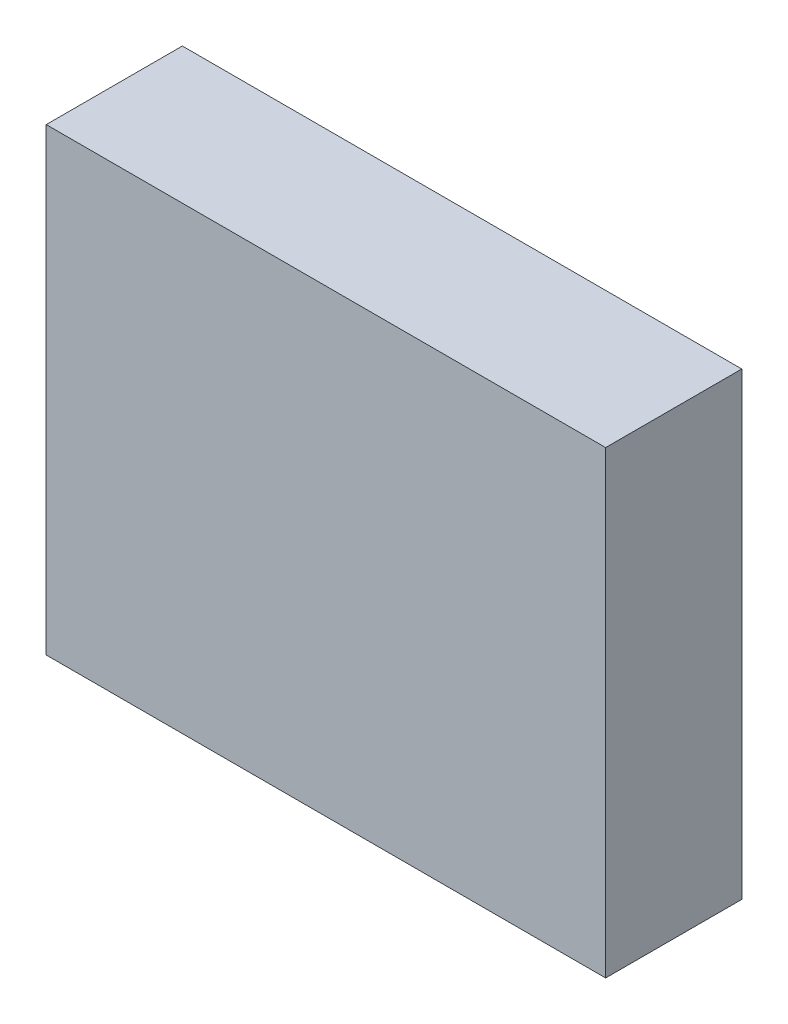
ISO-10303-21;
HEADER;
FILE_DESCRIPTION(('STEP AP214'),'2;1');
FILE_NAME('part.step','',(''),(''),'','','');
FILE_SCHEMA(('AUTOMOTIVE_DESIGN { 1 0 10303 214 1 1 1 1 }'));
ENDSEC;
DATA;
#1=APPLICATION_CONTEXT('core data for automotive mechanical design processes');
#2=APPLICATION_PROTOCOL_DEFINITION('international standard','automotive_design',2000,#1);
#3=PRODUCT_CONTEXT('',#1,'mechanical');
#4=PRODUCT('Part','Part','',(#3));
#5=PRODUCT_RELATED_PRODUCT_CATEGORY('part','',(#4));
#6=PRODUCT_DEFINITION_FORMATION('','',#4);
#7=PRODUCT_DEFINITION_CONTEXT('part definition',#1,'design');
#8=PRODUCT_DEFINITION('design','',#6,#7);
#9=PRODUCT_DEFINITION_SHAPE('','',#8);
#10=(LENGTH_UNIT() NAMED_UNIT(*) SI_UNIT(.MILLI.,.METRE.));
#11=(NAMED_UNIT(*) PLANE_ANGLE_UNIT() SI_UNIT($,.RADIAN.));
#12=(NAMED_UNIT(*) SI_UNIT($,.STERADIAN.) SOLID_ANGLE_UNIT());
#13=UNCERTAINTY_MEASURE_WITH_UNIT(LENGTH_MEASURE(1.E-05),#10,'distance_accuracy_value','');
#14=(GEOMETRIC_REPRESENTATION_CONTEXT(3) GLOBAL_UNCERTAINTY_ASSIGNED_CONTEXT((#13)) GLOBAL_UNIT_ASSIGNED_CONTEXT((#10,
#11,#12)) REPRESENTATION_CONTEXT('',''));
#15=CARTESIAN_POINT('',(0.,0.,0.));
#16=DIRECTION('',(0.,0.,1.));
#17=DIRECTION('',(1.,0.,0.));
#18=AXIS2_PLACEMENT_3D('',#15,#16,#17);
#19=CARTESIAN_POINT('',(62.21,27.071,0.505));
#20=DIRECTION('',(0.,0.,1.));
#21=DIRECTION('',(1.,0.,0.));
#22=AXIS2_PLACEMENT_3D('',#19,#20,#21);
#23=PLANE('',#22);
#24=DIRECTION('',(0.,1.,0.));
#25=VECTOR('',#24,1.);
#26=CARTESIAN_POINT('',(52.31207,34.316,0.505));
#27=LINE('',#26,#25);
#28=CARTESIAN_POINT('',(52.31207,35.324,0.505));
#29=VERTEX_POINT('',#28);
#30=CARTESIAN_POINT('',(52.31207,33.623,0.505));
#31=VERTEX_POINT('',#30);
#32=EDGE_CURVE('E60',#29,#31,#27,.F.);
#33=ORIENTED_EDGE('',*,*,#32,.F.);
#34=DIRECTION('',(-1.,0.,0.));
#35=VECTOR('',#34,1.);
#36=CARTESIAN_POINT('',(51.185,35.324,0.505));
#37=LINE('',#36,#35);
#38=CARTESIAN_POINT('',(50.24063,35.324,0.505));
#39=VERTEX_POINT('',#38);
#40=EDGE_CURVE('E53',#39,#29,#37,.F.);
#41=ORIENTED_EDGE('',*,*,#40,.F.);
#42=DIRECTION('',(0.,1.,0.));
#43=VECTOR('',#42,1.);
#44=CARTESIAN_POINT('',(50.24063,27.071,0.505));
#45=LINE('',#44,#43);
#46=CARTESIAN_POINT('',(50.24063,33.623,0.505));
#47=VERTEX_POINT('',#46);
#48=EDGE_CURVE('E20',#39,#47,#45,.F.);
#49=ORIENTED_EDGE('',*,*,#48,.T.);
#50=DIRECTION('',(1.,0.,0.));
#51=VECTOR('',#50,1.);
#52=CARTESIAN_POINT('',(51.185,33.623,0.505));
#53=LINE('',#52,#51);
#54=EDGE_CURVE('E58',#31,#47,#53,.F.);
#55=ORIENTED_EDGE('',*,*,#54,.F.);
#56=EDGE_LOOP('',(#33,#41,#49,#55));
#57=FACE_BOUND('',#56,.T.);
#58=ADVANCED_FACE('F17',(#57),#23,.T.);
#59=CARTESIAN_POINT('',(51.185,33.623,0.127));
#60=DIRECTION('',(0.,-1.,0.));
#61=DIRECTION('',(1.,0.,0.));
#62=AXIS2_PLACEMENT_3D('',#59,#60,#61);
#63=PLANE('',#62);
#64=DIRECTION('',(0.,0.,1.));
#65=VECTOR('',#64,1.);
#66=CARTESIAN_POINT('',(52.31207,33.623,0.064));
#67=LINE('',#66,#65);
#68=CARTESIAN_POINT('',(52.31207,33.623,0.000999999999999265));
#69=VERTEX_POINT('',#68);
#70=EDGE_CURVE('E66',#31,#69,#67,.F.);
#71=ORIENTED_EDGE('',*,*,#70,.F.);
#72=ORIENTED_EDGE('',*,*,#54,.T.);
#73=DIRECTION('',(0.,0.,1.));
#74=VECTOR('',#73,1.);
#75=CARTESIAN_POINT('',(50.24063,33.623,-1.6327145543379));
#76=LINE('',#75,#74);
#77=CARTESIAN_POINT('',(50.24063,33.623,0.000999999999999265));
#78=VERTEX_POINT('',#77);
#79=EDGE_CURVE('E80',#47,#78,#76,.F.);
#80=ORIENTED_EDGE('',*,*,#79,.T.);
#81=DIRECTION('',(1.,0.,0.));
#82=VECTOR('',#81,1.);
#83=CARTESIAN_POINT('',(62.21,33.623,0.000999999999999265));
#84=LINE('',#83,#82);
#85=EDGE_CURVE('E75',#78,#69,#84,.T.);
#86=ORIENTED_EDGE('',*,*,#85,.T.);
#87=EDGE_LOOP('',(#71,#72,#80,#86));
#88=FACE_BOUND('',#87,.T.);
#89=ADVANCED_FACE('F74',(#88),#63,.T.);
#90=CARTESIAN_POINT('',(52.31207,34.316,0.064));
#91=DIRECTION('',(1.,0.,0.));
#92=DIRECTION('',(0.,1.,0.));
#93=AXIS2_PLACEMENT_3D('',#90,#91,#92);
#94=PLANE('',#93);
#95=DIRECTION('',(0.,0.,1.));
#96=VECTOR('',#95,1.);
#97=CARTESIAN_POINT('',(52.31207,35.324,0.127));
#98=LINE('',#97,#96);
#99=CARTESIAN_POINT('',(52.31207,35.324,0.000999999999999265));
#100=VERTEX_POINT('',#99);
#101=EDGE_CURVE('E71',#29,#100,#98,.F.);
#102=ORIENTED_EDGE('',*,*,#101,.F.);
#103=ORIENTED_EDGE('',*,*,#32,.T.);
#104=ORIENTED_EDGE('',*,*,#70,.T.);
#105=DIRECTION('',(0.,1.,0.));
#106=VECTOR('',#105,1.);
#107=CARTESIAN_POINT('',(52.31207,27.071,0.000999999999999265));
#108=LINE('',#107,#106);
#109=EDGE_CURVE('E84',#69,#100,#108,.T.);
#110=ORIENTED_EDGE('',*,*,#109,.T.);
#111=EDGE_LOOP('',(#102,#103,#104,#110));
#112=FACE_BOUND('',#111,.T.);
#113=ADVANCED_FACE('F68',(#112),#94,.T.);
#114=CARTESIAN_POINT('',(51.185,35.324,0.127));
#115=DIRECTION('',(0.,1.,0.));
#116=DIRECTION('',(-1.,0.,0.));
#117=AXIS2_PLACEMENT_3D('',#114,#115,#116);
#118=PLANE('',#117);
#119=ORIENTED_EDGE('',*,*,#101,.T.);
#120=DIRECTION('',(1.,0.,0.));
#121=VECTOR('',#120,1.);
#122=CARTESIAN_POINT('',(62.21,35.324,0.000999999999999265));
#123=LINE('',#122,#121);
#124=CARTESIAN_POINT('',(50.24063,35.324,0.000999999999999265));
#125=VERTEX_POINT('',#124);
#126=EDGE_CURVE('E26',#100,#125,#123,.F.);
#127=ORIENTED_EDGE('',*,*,#126,.T.);
#128=DIRECTION('',(0.,0.,1.));
#129=VECTOR('',#128,1.);
#130=CARTESIAN_POINT('',(50.24063,35.324,-1.6327145543379));
#131=LINE('',#130,#129);
#132=EDGE_CURVE('E34',#125,#39,#131,.T.);
#133=ORIENTED_EDGE('',*,*,#132,.T.);
#134=ORIENTED_EDGE('',*,*,#40,.T.);
#135=EDGE_LOOP('',(#119,#127,#133,#134));
#136=FACE_BOUND('',#135,.T.);
#137=ADVANCED_FACE('F88',(#136),#118,.T.);
#138=CARTESIAN_POINT('',(50.24063,34.316,-1.6327145543379));
#139=DIRECTION('',(1.,0.,0.));
#140=DIRECTION('',(0.,1.,0.));
#141=AXIS2_PLACEMENT_3D('',#138,#139,#140);
#142=PLANE('',#141);
#143=ORIENTED_EDGE('',*,*,#132,.F.);
#144=DIRECTION('',(0.,1.,0.));
#145=VECTOR('',#144,1.);
#146=CARTESIAN_POINT('',(50.24063,27.071,0.000999999999999265));
#147=LINE('',#146,#145);
#148=EDGE_CURVE('E11',#125,#78,#147,.F.);
#149=ORIENTED_EDGE('',*,*,#148,.T.);
#150=ORIENTED_EDGE('',*,*,#79,.F.);
#151=ORIENTED_EDGE('',*,*,#48,.F.);
#152=EDGE_LOOP('',(#143,#149,#150,#151));
#153=FACE_BOUND('',#152,.T.);
#154=ADVANCED_FACE('F91',(#153),#142,.F.);
#155=CARTESIAN_POINT('',(62.21,27.071,0.000999999999999265));
#156=DIRECTION('',(0.,0.,1.));
#157=DIRECTION('',(1.,0.,0.));
#158=AXIS2_PLACEMENT_3D('',#155,#156,#157);
#159=PLANE('',#158);
#160=ORIENTED_EDGE('',*,*,#126,.F.);
#161=ORIENTED_EDGE('',*,*,#109,.F.);
#162=ORIENTED_EDGE('',*,*,#85,.F.);
#163=ORIENTED_EDGE('',*,*,#148,.F.);
#164=EDGE_LOOP('',(#160,#161,#162,#163));
#165=FACE_BOUND('',#164,.T.);
#166=ADVANCED_FACE('F90',(#165),#159,.F.);
#167=CLOSED_SHELL('',(#58,#89,#113,#137,#154,#166));
#168=MANIFOLD_SOLID_BREP('B1',#167);
#169=ADVANCED_BREP_SHAPE_REPRESENTATION('',(#18,#168),#14);
#170=SHAPE_DEFINITION_REPRESENTATION(#9,#169);
ENDSEC;
END-ISO-10303-21;
